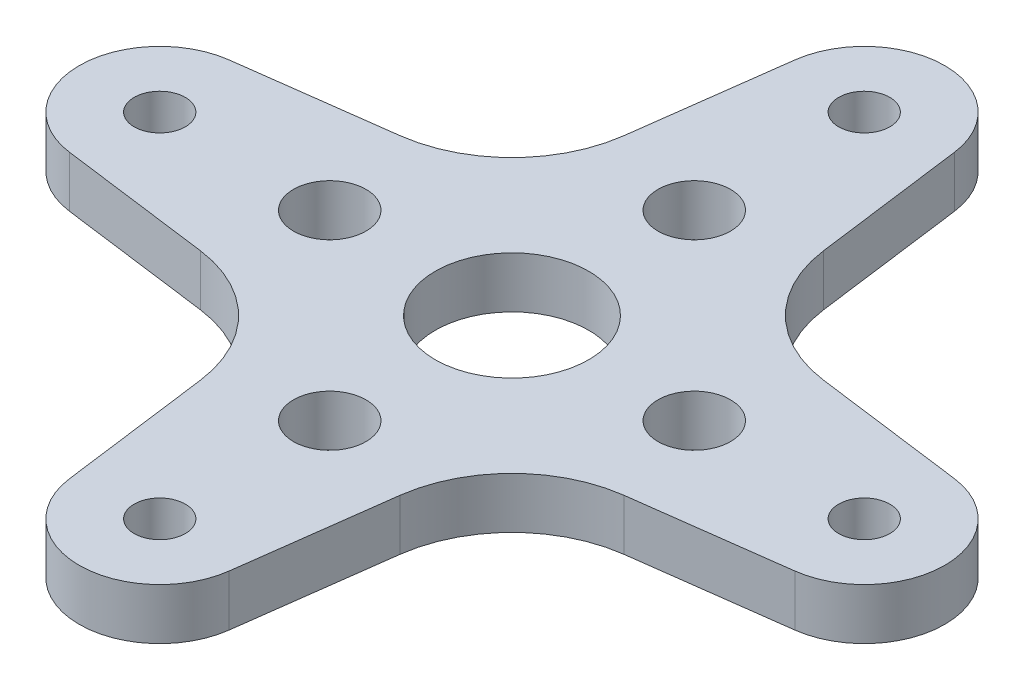
ISO-10303-21;
HEADER;
FILE_DESCRIPTION(('STEP AP214'),'2;1');
FILE_NAME('part.step','',(''),(''),'','','');
FILE_SCHEMA(('AUTOMOTIVE_DESIGN { 1 0 10303 214 1 1 1 1 }'));
ENDSEC;
DATA;
#1=APPLICATION_CONTEXT('core data for automotive mechanical design processes');
#2=APPLICATION_PROTOCOL_DEFINITION('international standard','automotive_design',2000,#1);
#3=PRODUCT_CONTEXT('',#1,'mechanical');
#4=PRODUCT('Part','Part','',(#3));
#5=PRODUCT_RELATED_PRODUCT_CATEGORY('part','',(#4));
#6=PRODUCT_DEFINITION_FORMATION('','',#4);
#7=PRODUCT_DEFINITION_CONTEXT('part definition',#1,'design');
#8=PRODUCT_DEFINITION('design','',#6,#7);
#9=PRODUCT_DEFINITION_SHAPE('','',#8);
#10=(LENGTH_UNIT() NAMED_UNIT(*) SI_UNIT(.MILLI.,.METRE.));
#11=(NAMED_UNIT(*) PLANE_ANGLE_UNIT() SI_UNIT($,.RADIAN.));
#12=(NAMED_UNIT(*) SI_UNIT($,.STERADIAN.) SOLID_ANGLE_UNIT());
#13=UNCERTAINTY_MEASURE_WITH_UNIT(LENGTH_MEASURE(1.E-05),#10,'distance_accuracy_value','');
#14=(GEOMETRIC_REPRESENTATION_CONTEXT(3) GLOBAL_UNCERTAINTY_ASSIGNED_CONTEXT((#13)) GLOBAL_UNIT_ASSIGNED_CONTEXT((#10,
#11,#12)) REPRESENTATION_CONTEXT('',''));
#15=CARTESIAN_POINT('',(0.,0.,0.));
#16=DIRECTION('',(0.,0.,1.));
#17=DIRECTION('',(1.,0.,0.));
#18=AXIS2_PLACEMENT_3D('',#15,#16,#17);
#19=CARTESIAN_POINT('',(0.,0.,-21.8652));
#20=DIRECTION('',(0.,-1.,0.));
#21=DIRECTION('',(0.,0.,-1.));
#22=AXIS2_PLACEMENT_3D('',#19,#20,#21);
#23=PLANE('',#22);
#24=CARTESIAN_POINT('',(0.,0.,-11.3137084989848));
#25=DIRECTION('',(0.,1.,0.));
#26=DIRECTION('',(0.,0.,1.));
#27=AXIS2_PLACEMENT_3D('',#24,#25,#26);
#28=CIRCLE('',#27,2.25);
#29=CARTESIAN_POINT('',(0.,0.,-9.06370849898476));
#30=VERTEX_POINT('',#29);
#31=EDGE_CURVE('E512',#30,#30,#28,.T.);
#32=ORIENTED_EDGE('',*,*,#31,.T.);
#33=EDGE_LOOP('',(#32));
#34=FACE_BOUND('',#33,.T.);
#35=CARTESIAN_POINT('',(11.3137084989848,0.,0.));
#36=DIRECTION('',(0.,1.,0.));
#37=DIRECTION('',(0.,0.,1.));
#38=AXIS2_PLACEMENT_3D('',#35,#36,#37);
#39=CIRCLE('',#38,2.25);
#40=CARTESIAN_POINT('',(11.3137084989848,0.,2.25));
#41=VERTEX_POINT('',#40);
#42=EDGE_CURVE('E506',#41,#41,#39,.T.);
#43=ORIENTED_EDGE('',*,*,#42,.T.);
#44=EDGE_LOOP('',(#43));
#45=FACE_BOUND('',#44,.T.);
#46=CARTESIAN_POINT('',(0.,0.,11.3137084989848));
#47=DIRECTION('',(0.,1.,0.));
#48=DIRECTION('',(0.,0.,1.));
#49=AXIS2_PLACEMENT_3D('',#46,#47,#48);
#50=CIRCLE('',#49,2.25);
#51=CARTESIAN_POINT('',(0.,0.,13.5637084989848));
#52=VERTEX_POINT('',#51);
#53=EDGE_CURVE('E500',#52,#52,#50,.T.);
#54=ORIENTED_EDGE('',*,*,#53,.T.);
#55=EDGE_LOOP('',(#54));
#56=FACE_BOUND('',#55,.T.);
#57=CARTESIAN_POINT('',(-11.3137084989848,0.,0.));
#58=DIRECTION('',(0.,1.,0.));
#59=DIRECTION('',(0.,0.,1.));
#60=AXIS2_PLACEMENT_3D('',#57,#58,#59);
#61=CIRCLE('',#60,2.25);
#62=CARTESIAN_POINT('',(-11.3137084989848,0.,2.25));
#63=VERTEX_POINT('',#62);
#64=EDGE_CURVE('E491',#63,#63,#61,.T.);
#65=ORIENTED_EDGE('',*,*,#64,.T.);
#66=EDGE_LOOP('',(#65));
#67=FACE_BOUND('',#66,.T.);
#68=CARTESIAN_POINT('',(0.,0.,0.));
#69=DIRECTION('',(0.,1.,0.));
#70=DIRECTION('',(0.,0.,1.));
#71=AXIS2_PLACEMENT_3D('',#68,#69,#70);
#72=CIRCLE('',#71,4.7625);
#73=CARTESIAN_POINT('',(0.,0.,4.7625));
#74=VERTEX_POINT('',#73);
#75=EDGE_CURVE('E488',#74,#74,#72,.T.);
#76=ORIENTED_EDGE('',*,*,#75,.T.);
#77=EDGE_LOOP('',(#76));
#78=FACE_BOUND('',#77,.T.);
#79=CARTESIAN_POINT('',(0.,0.,-21.8652));
#80=DIRECTION('',(0.,1.,0.));
#81=DIRECTION('',(0.,0.,1.));
#82=AXIS2_PLACEMENT_3D('',#79,#80,#81);
#83=CIRCLE('',#82,1.5875);
#84=CARTESIAN_POINT('',(0.,0.,-20.2777));
#85=VERTEX_POINT('',#84);
#86=EDGE_CURVE('E482',#85,#85,#83,.T.);
#87=ORIENTED_EDGE('',*,*,#86,.T.);
#88=EDGE_LOOP('',(#87));
#89=FACE_BOUND('',#88,.T.);
#90=CARTESIAN_POINT('',(0.,0.,-21.8652));
#91=DIRECTION('',(0.,1.,0.));
#92=DIRECTION('',(0.,0.,-1.));
#93=AXIS2_PLACEMENT_3D('',#90,#91,#92);
#94=CIRCLE('',#93,5.);
#95=CARTESIAN_POINT('',(4.95722430686906,0.,-22.5178309611002));
#96=VERTEX_POINT('',#95);
#97=CARTESIAN_POINT('',(-4.95722430686906,0.,-22.5178309611002));
#98=VERTEX_POINT('',#97);
#99=EDGE_CURVE('E145',#96,#98,#94,.T.);
#100=ORIENTED_EDGE('',*,*,#99,.F.);
#101=DIRECTION('',(-0.130526192220045,0.,-0.991444861373811));
#102=VECTOR('',#101,1.);
#103=CARTESIAN_POINT('',(4.95722430686906,0.,-22.5178309611002));
#104=LINE('',#103,#102);
#105=CARTESIAN_POINT('',(6.19257156323282,0.,-13.1344369579309));
#106=VERTEX_POINT('',#105);
#107=EDGE_CURVE('E93',#106,#96,#104,.T.);
#108=ORIENTED_EDGE('',*,*,#107,.F.);
#109=CARTESIAN_POINT('',(14.1869118191913,0.,-14.1869118191913));
#110=DIRECTION('',(0.,-1.,0.));
#111=DIRECTION('',(0.,0.,1.));
#112=AXIS2_PLACEMENT_3D('',#109,#110,#111);
#113=CIRCLE('',#112,8.06332310289146);
#114=CARTESIAN_POINT('',(13.1344369579309,0.,-6.19257156323278));
#115=VERTEX_POINT('',#114);
#116=EDGE_CURVE('E87',#115,#106,#113,.T.);
#117=ORIENTED_EDGE('',*,*,#116,.F.);
#118=DIRECTION('',(-0.991444861373811,0.,-0.130526192220049));
#119=VECTOR('',#118,1.);
#120=CARTESIAN_POINT('',(22.5178309611002,0.,-4.95722430686898));
#121=LINE('',#120,#119);
#122=CARTESIAN_POINT('',(22.5178309611002,0.,-4.95722430686898));
#123=VERTEX_POINT('',#122);
#124=EDGE_CURVE('E132',#123,#115,#121,.T.);
#125=ORIENTED_EDGE('',*,*,#124,.F.);
#126=CARTESIAN_POINT('',(21.8652,0.,0.));
#127=DIRECTION('',(0.,1.,0.));
#128=DIRECTION('',(0.,0.,1.));
#129=AXIS2_PLACEMENT_3D('',#126,#127,#128);
#130=CIRCLE('',#129,5.);
#131=CARTESIAN_POINT('',(22.5178309611002,0.,4.95722430686913));
#132=VERTEX_POINT('',#131);
#133=EDGE_CURVE('E163',#132,#123,#130,.T.);
#134=ORIENTED_EDGE('',*,*,#133,.F.);
#135=DIRECTION('',(0.991444861373812,0.,-0.130526192220042));
#136=VECTOR('',#135,1.);
#137=CARTESIAN_POINT('',(22.5178309611002,0.,4.95722430686913));
#138=LINE('',#137,#136);
#139=CARTESIAN_POINT('',(13.1344369579309,0.,6.19257156323287));
#140=VERTEX_POINT('',#139);
#141=EDGE_CURVE('E160',#140,#132,#138,.T.);
#142=ORIENTED_EDGE('',*,*,#141,.F.);
#143=CARTESIAN_POINT('',(14.1869118191912,0.,14.1869118191913));
#144=DIRECTION('',(0.,-1.,0.));
#145=DIRECTION('',(0.,0.,1.));
#146=AXIS2_PLACEMENT_3D('',#143,#144,#145);
#147=CIRCLE('',#146,8.06332310289146);
#148=CARTESIAN_POINT('',(6.19257156323283,0.,13.1344369579309));
#149=VERTEX_POINT('',#148);
#150=EDGE_CURVE('E157',#149,#140,#147,.T.);
#151=ORIENTED_EDGE('',*,*,#150,.F.);
#152=DIRECTION('',(-0.130526192220045,0.,0.991444861373811));
#153=VECTOR('',#152,1.);
#154=CARTESIAN_POINT('',(4.95722430686907,0.,22.5178309611002));
#155=LINE('',#154,#153);
#156=CARTESIAN_POINT('',(4.95722430686906,0.,22.5178309611002));
#157=VERTEX_POINT('',#156);
#158=EDGE_CURVE('E212',#149,#157,#155,.T.);
#159=ORIENTED_EDGE('',*,*,#158,.T.);
#160=CARTESIAN_POINT('',(0.,0.,21.8652));
#161=DIRECTION('',(0.,-1.,0.));
#162=DIRECTION('',(1.,0.,0.));
#163=AXIS2_PLACEMENT_3D('',#160,#161,#162);
#164=CIRCLE('',#163,5.);
#165=CARTESIAN_POINT('',(-4.95722430686904,0.,22.5178309611002));
#166=VERTEX_POINT('',#165);
#167=EDGE_CURVE('E220',#157,#166,#164,.T.);
#168=ORIENTED_EDGE('',*,*,#167,.T.);
#169=DIRECTION('',(-0.130526192220046,0.,-0.991444861373811));
#170=VECTOR('',#169,1.);
#171=CARTESIAN_POINT('',(-4.95722430686904,0.,22.5178309611002));
#172=LINE('',#171,#170);
#173=CARTESIAN_POINT('',(-6.19257156323282,0.,13.1344369579309));
#174=VERTEX_POINT('',#173);
#175=EDGE_CURVE('E305',#166,#174,#172,.T.);
#176=ORIENTED_EDGE('',*,*,#175,.T.);
#177=CARTESIAN_POINT('',(-14.1869118191913,0.,14.1869118191913));
#178=DIRECTION('',(0.,1.,0.));
#179=DIRECTION('',(1.,0.,0.));
#180=AXIS2_PLACEMENT_3D('',#177,#178,#179);
#181=CIRCLE('',#180,8.06332310289146);
#182=CARTESIAN_POINT('',(-13.1344369579309,0.,6.19257156323279));
#183=VERTEX_POINT('',#182);
#184=EDGE_CURVE('E301',#174,#183,#181,.T.);
#185=ORIENTED_EDGE('',*,*,#184,.T.);
#186=DIRECTION('',(-0.991444861373811,0.,-0.130526192220048));
#187=VECTOR('',#186,1.);
#188=CARTESIAN_POINT('',(-22.5178309611002,0.,4.957224306869));
#189=LINE('',#188,#187);
#190=CARTESIAN_POINT('',(-22.5178309611002,0.,4.957224306869));
#191=VERTEX_POINT('',#190);
#192=EDGE_CURVE('E297',#183,#191,#189,.T.);
#193=ORIENTED_EDGE('',*,*,#192,.T.);
#194=CARTESIAN_POINT('',(-21.8652,0.,0.));
#195=DIRECTION('',(0.,-1.,0.));
#196=DIRECTION('',(-1.,0.,0.));
#197=AXIS2_PLACEMENT_3D('',#194,#195,#196);
#198=CIRCLE('',#197,5.);
#199=CARTESIAN_POINT('',(-22.5178309611002,0.,-4.95722430686912));
#200=VERTEX_POINT('',#199);
#201=EDGE_CURVE('E206',#191,#200,#198,.T.);
#202=ORIENTED_EDGE('',*,*,#201,.T.);
#203=DIRECTION('',(0.991444861373812,0.,-0.130526192220042));
#204=VECTOR('',#203,1.);
#205=CARTESIAN_POINT('',(-22.5178309611002,0.,-4.95722430686912));
#206=LINE('',#205,#204);
#207=CARTESIAN_POINT('',(-13.1344369579309,0.,-6.19257156323286));
#208=VERTEX_POINT('',#207);
#209=EDGE_CURVE('E203',#200,#208,#206,.T.);
#210=ORIENTED_EDGE('',*,*,#209,.T.);
#211=CARTESIAN_POINT('',(-14.1869118191913,0.,-14.1869118191913));
#212=DIRECTION('',(0.,-1.,0.));
#213=DIRECTION('',(0.,0.,-1.));
#214=AXIS2_PLACEMENT_3D('',#211,#212,#213);
#215=CIRCLE('',#214,8.06332310289146);
#216=CARTESIAN_POINT('',(-6.19257156323282,0.,-13.1344369579309));
#217=VERTEX_POINT('',#216);
#218=EDGE_CURVE('E153',#217,#208,#215,.T.);
#219=ORIENTED_EDGE('',*,*,#218,.F.);
#220=DIRECTION('',(-0.130526192220045,0.,0.991444861373811));
#221=VECTOR('',#220,1.);
#222=CARTESIAN_POINT('',(-4.95722430686906,0.,-22.5178309611002));
#223=LINE('',#222,#221);
#224=EDGE_CURVE('E149',#98,#217,#223,.T.);
#225=ORIENTED_EDGE('',*,*,#224,.F.);
#226=EDGE_LOOP('',(#100,#108,#117,#125,#134,#142,#151,#159,#168,#176,#185,#193,#202,#210,#219,#225));
#227=FACE_BOUND('',#226,.T.);
#228=CARTESIAN_POINT('',(21.8652,0.,0.));
#229=DIRECTION('',(0.,1.,0.));
#230=DIRECTION('',(0.,0.,1.));
#231=AXIS2_PLACEMENT_3D('',#228,#229,#230);
#232=CIRCLE('',#231,1.5875);
#233=CARTESIAN_POINT('',(21.8652,0.,1.58750000000007));
#234=VERTEX_POINT('',#233);
#235=EDGE_CURVE('E298',#234,#234,#232,.T.);
#236=ORIENTED_EDGE('',*,*,#235,.T.);
#237=EDGE_LOOP('',(#236));
#238=FACE_BOUND('',#237,.T.);
#239=CARTESIAN_POINT('',(-21.8652,0.,0.));
#240=DIRECTION('',(0.,1.,0.));
#241=DIRECTION('',(0.,0.,1.));
#242=AXIS2_PLACEMENT_3D('',#239,#240,#241);
#243=CIRCLE('',#242,1.5875);
#244=CARTESIAN_POINT('',(-21.8652,0.,1.58749999999994));
#245=VERTEX_POINT('',#244);
#246=EDGE_CURVE('E466',#245,#245,#243,.T.);
#247=ORIENTED_EDGE('',*,*,#246,.T.);
#248=EDGE_LOOP('',(#247));
#249=FACE_BOUND('',#248,.T.);
#250=CARTESIAN_POINT('',(0.,0.,21.8652));
#251=DIRECTION('',(0.,1.,0.));
#252=DIRECTION('',(0.,0.,1.));
#253=AXIS2_PLACEMENT_3D('',#250,#251,#252);
#254=CIRCLE('',#253,1.5875);
#255=CARTESIAN_POINT('',(0.,0.,23.4527));
#256=VERTEX_POINT('',#255);
#257=EDGE_CURVE('E476',#256,#256,#254,.T.);
#258=ORIENTED_EDGE('',*,*,#257,.T.);
#259=EDGE_LOOP('',(#258));
#260=FACE_BOUND('',#259,.T.);
#261=ADVANCED_FACE('F39',(#34,#45,#56,#67,#78,#89,#227,#238,#249,#260),#23,.T.);
#262=CARTESIAN_POINT('',(0.,3.175,-21.8652));
#263=DIRECTION('',(0.,-1.,0.));
#264=DIRECTION('',(0.,0.,-1.));
#265=AXIS2_PLACEMENT_3D('',#262,#263,#264);
#266=CYLINDRICAL_SURFACE('',#265,5.);
#267=ORIENTED_EDGE('',*,*,#99,.T.);
#268=DIRECTION('',(0.,-1.,0.));
#269=VECTOR('',#268,1.);
#270=CARTESIAN_POINT('',(-4.95722430686906,3.175,-22.5178309611002));
#271=LINE('',#270,#269);
#272=CARTESIAN_POINT('',(-4.95722430686906,3.175,-22.5178309611002));
#273=VERTEX_POINT('',#272);
#274=EDGE_CURVE('E11',#273,#98,#271,.T.);
#275=ORIENTED_EDGE('',*,*,#274,.F.);
#276=CARTESIAN_POINT('',(0.,3.175,-21.8652));
#277=DIRECTION('',(0.,1.,0.));
#278=DIRECTION('',(0.,0.,-1.));
#279=AXIS2_PLACEMENT_3D('',#276,#277,#278);
#280=CIRCLE('',#279,5.);
#281=CARTESIAN_POINT('',(4.95722430686906,3.175,-22.5178309611002));
#282=VERTEX_POINT('',#281);
#283=EDGE_CURVE('E172',#282,#273,#280,.T.);
#284=ORIENTED_EDGE('',*,*,#283,.F.);
#285=DIRECTION('',(0.,-1.,0.));
#286=VECTOR('',#285,1.);
#287=CARTESIAN_POINT('',(4.95722430686906,3.175,-22.5178309611002));
#288=LINE('',#287,#286);
#289=EDGE_CURVE('E141',#282,#96,#288,.T.);
#290=ORIENTED_EDGE('',*,*,#289,.T.);
#291=EDGE_LOOP('',(#267,#275,#284,#290));
#292=FACE_BOUND('',#291,.T.);
#293=ADVANCED_FACE('F41',(#292),#266,.T.);
#294=CARTESIAN_POINT('',(-4.95722430686906,3.175,-22.5178309611002));
#295=DIRECTION('',(0.991444861373811,0.,0.130526192220045));
#296=DIRECTION('',(0.130526192220045,0.,-0.991444861373811));
#297=AXIS2_PLACEMENT_3D('',#294,#295,#296);
#298=PLANE('',#297);
#299=ORIENTED_EDGE('',*,*,#224,.T.);
#300=DIRECTION('',(0.,-1.,0.));
#301=VECTOR('',#300,1.);
#302=CARTESIAN_POINT('',(-6.19257156323282,3.175,-13.1344369579309));
#303=LINE('',#302,#301);
#304=CARTESIAN_POINT('',(-6.19257156323282,3.175,-13.1344369579309));
#305=VERTEX_POINT('',#304);
#306=EDGE_CURVE('E49',#305,#217,#303,.T.);
#307=ORIENTED_EDGE('',*,*,#306,.F.);
#308=DIRECTION('',(-0.130526192220045,0.,0.991444861373811));
#309=VECTOR('',#308,1.);
#310=CARTESIAN_POINT('',(-4.95722430686906,3.175,-22.5178309611002));
#311=LINE('',#310,#309);
#312=EDGE_CURVE('E101',#273,#305,#311,.T.);
#313=ORIENTED_EDGE('',*,*,#312,.F.);
#314=ORIENTED_EDGE('',*,*,#274,.T.);
#315=EDGE_LOOP('',(#299,#307,#313,#314));
#316=FACE_BOUND('',#315,.T.);
#317=ADVANCED_FACE('F356',(#316),#298,.F.);
#318=CARTESIAN_POINT('',(-14.1869118191913,3.175,-14.1869118191913));
#319=DIRECTION('',(0.,-1.,0.));
#320=DIRECTION('',(0.,0.,-1.));
#321=AXIS2_PLACEMENT_3D('',#318,#319,#320);
#322=CYLINDRICAL_SURFACE('',#321,8.06332310289146);
#323=ORIENTED_EDGE('',*,*,#218,.T.);
#324=DIRECTION('',(0.,-1.,0.));
#325=VECTOR('',#324,1.);
#326=CARTESIAN_POINT('',(-13.1344369579309,3.175,-6.19257156323286));
#327=LINE('',#326,#325);
#328=CARTESIAN_POINT('',(-13.1344369579309,3.175,-6.19257156323286));
#329=VERTEX_POINT('',#328);
#330=EDGE_CURVE('E228',#329,#208,#327,.T.);
#331=ORIENTED_EDGE('',*,*,#330,.F.);
#332=CARTESIAN_POINT('',(-14.1869118191913,3.175,-14.1869118191913));
#333=DIRECTION('',(0.,-1.,0.));
#334=DIRECTION('',(0.,0.,-1.));
#335=AXIS2_PLACEMENT_3D('',#332,#333,#334);
#336=CIRCLE('',#335,8.06332310289146);
#337=EDGE_CURVE('E196',#305,#329,#336,.T.);
#338=ORIENTED_EDGE('',*,*,#337,.F.);
#339=ORIENTED_EDGE('',*,*,#306,.T.);
#340=EDGE_LOOP('',(#323,#331,#338,#339));
#341=FACE_BOUND('',#340,.T.);
#342=ADVANCED_FACE('F191',(#341),#322,.F.);
#343=CARTESIAN_POINT('',(14.1869118191912,3.175,14.1869118191913));
#344=DIRECTION('',(0.,-1.,0.));
#345=DIRECTION('',(0.,0.,-1.));
#346=AXIS2_PLACEMENT_3D('',#343,#344,#345);
#347=CYLINDRICAL_SURFACE('',#346,8.06332310289146);
#348=ORIENTED_EDGE('',*,*,#150,.T.);
#349=DIRECTION('',(0.,-1.,0.));
#350=VECTOR('',#349,1.);
#351=CARTESIAN_POINT('',(13.1344369579309,3.175,6.19257156323287));
#352=LINE('',#351,#350);
#353=CARTESIAN_POINT('',(13.1344369579309,3.175,6.19257156323287));
#354=VERTEX_POINT('',#353);
#355=EDGE_CURVE('E183',#354,#140,#352,.T.);
#356=ORIENTED_EDGE('',*,*,#355,.F.);
#357=CARTESIAN_POINT('',(14.1869118191912,3.175,14.1869118191913));
#358=DIRECTION('',(0.,-1.,0.));
#359=DIRECTION('',(0.,0.,1.));
#360=AXIS2_PLACEMENT_3D('',#357,#358,#359);
#361=CIRCLE('',#360,8.06332310289146);
#362=CARTESIAN_POINT('',(6.19257156323283,3.175,13.1344369579309));
#363=VERTEX_POINT('',#362);
#364=EDGE_CURVE('E261',#363,#354,#361,.T.);
#365=ORIENTED_EDGE('',*,*,#364,.F.);
#366=DIRECTION('',(0.,-1.,0.));
#367=VECTOR('',#366,1.);
#368=CARTESIAN_POINT('',(6.19257156323283,3.175,13.1344369579309));
#369=LINE('',#368,#367);
#370=EDGE_CURVE('E232',#363,#149,#369,.T.);
#371=ORIENTED_EDGE('',*,*,#370,.T.);
#372=EDGE_LOOP('',(#348,#356,#365,#371));
#373=FACE_BOUND('',#372,.T.);
#374=ADVANCED_FACE('F362',(#373),#347,.F.);
#375=CARTESIAN_POINT('',(22.5178309611002,3.175,4.95722430686913));
#376=DIRECTION('',(-0.130526192220042,0.,-0.991444861373812));
#377=DIRECTION('',(-0.991444861373812,0.,0.130526192220042));
#378=AXIS2_PLACEMENT_3D('',#375,#376,#377);
#379=PLANE('',#378);
#380=ORIENTED_EDGE('',*,*,#141,.T.);
#381=DIRECTION('',(0.,-1.,0.));
#382=VECTOR('',#381,1.);
#383=CARTESIAN_POINT('',(22.5178309611002,3.175,4.95722430686913));
#384=LINE('',#383,#382);
#385=CARTESIAN_POINT('',(22.5178309611002,3.175,4.95722430686913));
#386=VERTEX_POINT('',#385);
#387=EDGE_CURVE('E179',#386,#132,#384,.T.);
#388=ORIENTED_EDGE('',*,*,#387,.F.);
#389=DIRECTION('',(0.991444861373812,0.,-0.130526192220042));
#390=VECTOR('',#389,1.);
#391=CARTESIAN_POINT('',(22.5178309611002,3.175,4.95722430686913));
#392=LINE('',#391,#390);
#393=EDGE_CURVE('E264',#354,#386,#392,.T.);
#394=ORIENTED_EDGE('',*,*,#393,.F.);
#395=ORIENTED_EDGE('',*,*,#355,.T.);
#396=EDGE_LOOP('',(#380,#388,#394,#395));
#397=FACE_BOUND('',#396,.T.);
#398=ADVANCED_FACE('F384',(#397),#379,.F.);
#399=CARTESIAN_POINT('',(21.8652,3.175,0.));
#400=DIRECTION('',(0.,-1.,0.));
#401=DIRECTION('',(0.,0.,-1.));
#402=AXIS2_PLACEMENT_3D('',#399,#400,#401);
#403=CYLINDRICAL_SURFACE('',#402,5.);
#404=ORIENTED_EDGE('',*,*,#133,.T.);
#405=DIRECTION('',(0.,-1.,0.));
#406=VECTOR('',#405,1.);
#407=CARTESIAN_POINT('',(22.5178309611002,3.175,-4.95722430686898));
#408=LINE('',#407,#406);
#409=CARTESIAN_POINT('',(22.5178309611002,3.175,-4.95722430686898));
#410=VERTEX_POINT('',#409);
#411=EDGE_CURVE('E134',#410,#123,#408,.T.);
#412=ORIENTED_EDGE('',*,*,#411,.F.);
#413=CARTESIAN_POINT('',(21.8652,3.175,0.));
#414=DIRECTION('',(0.,1.,0.));
#415=DIRECTION('',(0.,0.,1.));
#416=AXIS2_PLACEMENT_3D('',#413,#414,#415);
#417=CIRCLE('',#416,5.);
#418=EDGE_CURVE('E123',#386,#410,#417,.T.);
#419=ORIENTED_EDGE('',*,*,#418,.F.);
#420=ORIENTED_EDGE('',*,*,#387,.T.);
#421=EDGE_LOOP('',(#404,#412,#419,#420));
#422=FACE_BOUND('',#421,.T.);
#423=ADVANCED_FACE('F381',(#422),#403,.T.);
#424=CARTESIAN_POINT('',(22.5178309611002,3.175,-4.95722430686898));
#425=DIRECTION('',(-0.130526192220049,0.,0.991444861373811));
#426=DIRECTION('',(0.991444861373811,0.,0.130526192220049));
#427=AXIS2_PLACEMENT_3D('',#424,#425,#426);
#428=PLANE('',#427);
#429=ORIENTED_EDGE('',*,*,#124,.T.);
#430=DIRECTION('',(0.,-1.,0.));
#431=VECTOR('',#430,1.);
#432=CARTESIAN_POINT('',(13.1344369579309,3.175,-6.19257156323278));
#433=LINE('',#432,#431);
#434=CARTESIAN_POINT('',(13.1344369579309,3.175,-6.19257156323278));
#435=VERTEX_POINT('',#434);
#436=EDGE_CURVE('E129',#435,#115,#433,.T.);
#437=ORIENTED_EDGE('',*,*,#436,.F.);
#438=DIRECTION('',(-0.991444861373811,0.,-0.130526192220049));
#439=VECTOR('',#438,1.);
#440=CARTESIAN_POINT('',(22.5178309611002,3.175,-4.95722430686898));
#441=LINE('',#440,#439);
#442=EDGE_CURVE('E117',#410,#435,#441,.T.);
#443=ORIENTED_EDGE('',*,*,#442,.F.);
#444=ORIENTED_EDGE('',*,*,#411,.T.);
#445=EDGE_LOOP('',(#429,#437,#443,#444));
#446=FACE_BOUND('',#445,.T.);
#447=ADVANCED_FACE('F130',(#446),#428,.F.);
#448=CARTESIAN_POINT('',(14.1869118191913,3.175,-14.1869118191913));
#449=DIRECTION('',(0.,-1.,0.));
#450=DIRECTION('',(0.,0.,-1.));
#451=AXIS2_PLACEMENT_3D('',#448,#449,#450);
#452=CYLINDRICAL_SURFACE('',#451,8.06332310289146);
#453=ORIENTED_EDGE('',*,*,#116,.T.);
#454=DIRECTION('',(0.,-1.,0.));
#455=VECTOR('',#454,1.);
#456=CARTESIAN_POINT('',(6.19257156323282,3.175,-13.1344369579309));
#457=LINE('',#456,#455);
#458=CARTESIAN_POINT('',(6.19257156323282,3.175,-13.1344369579309));
#459=VERTEX_POINT('',#458);
#460=EDGE_CURVE('E135',#459,#106,#457,.T.);
#461=ORIENTED_EDGE('',*,*,#460,.F.);
#462=CARTESIAN_POINT('',(14.1869118191913,3.175,-14.1869118191913));
#463=DIRECTION('',(0.,-1.,0.));
#464=DIRECTION('',(0.,0.,1.));
#465=AXIS2_PLACEMENT_3D('',#462,#463,#464);
#466=CIRCLE('',#465,8.06332310289146);
#467=EDGE_CURVE('E121',#435,#459,#466,.T.);
#468=ORIENTED_EDGE('',*,*,#467,.F.);
#469=ORIENTED_EDGE('',*,*,#436,.T.);
#470=EDGE_LOOP('',(#453,#461,#468,#469));
#471=FACE_BOUND('',#470,.T.);
#472=ADVANCED_FACE('F137',(#471),#452,.F.);
#473=CARTESIAN_POINT('',(4.95722430686906,3.175,-22.5178309611002));
#474=DIRECTION('',(-0.991444861373811,0.,0.130526192220045));
#475=DIRECTION('',(0.130526192220045,0.,0.991444861373811));
#476=AXIS2_PLACEMENT_3D('',#473,#474,#475);
#477=PLANE('',#476);
#478=ORIENTED_EDGE('',*,*,#107,.T.);
#479=ORIENTED_EDGE('',*,*,#289,.F.);
#480=DIRECTION('',(-0.130526192220045,0.,-0.991444861373811));
#481=VECTOR('',#480,1.);
#482=CARTESIAN_POINT('',(4.95722430686906,3.175,-22.5178309611002));
#483=LINE('',#482,#481);
#484=EDGE_CURVE('E57',#459,#282,#483,.T.);
#485=ORIENTED_EDGE('',*,*,#484,.F.);
#486=ORIENTED_EDGE('',*,*,#460,.T.);
#487=EDGE_LOOP('',(#478,#479,#485,#486));
#488=FACE_BOUND('',#487,.T.);
#489=ADVANCED_FACE('F374',(#488),#477,.F.);
#490=CARTESIAN_POINT('',(0.,3.175,-21.8652));
#491=DIRECTION('',(0.,-1.,0.));
#492=DIRECTION('',(0.,0.,-1.));
#493=AXIS2_PLACEMENT_3D('',#490,#491,#492);
#494=PLANE('',#493);
#495=CARTESIAN_POINT('',(0.,3.175,-11.3137084989848));
#496=DIRECTION('',(0.,1.,0.));
#497=DIRECTION('',(0.,0.,1.));
#498=AXIS2_PLACEMENT_3D('',#495,#496,#497);
#499=CIRCLE('',#498,2.25);
#500=CARTESIAN_POINT('',(0.,3.175,-9.06370849898476));
#501=VERTEX_POINT('',#500);
#502=EDGE_CURVE('E432',#501,#501,#499,.T.);
#503=ORIENTED_EDGE('',*,*,#502,.F.);
#504=EDGE_LOOP('',(#503));
#505=FACE_BOUND('',#504,.T.);
#506=CARTESIAN_POINT('',(11.3137084989848,3.175,0.));
#507=DIRECTION('',(0.,1.,0.));
#508=DIRECTION('',(0.,0.,1.));
#509=AXIS2_PLACEMENT_3D('',#506,#507,#508);
#510=CIRCLE('',#509,2.25);
#511=CARTESIAN_POINT('',(11.3137084989848,3.175,2.25));
#512=VERTEX_POINT('',#511);
#513=EDGE_CURVE('E436',#512,#512,#510,.T.);
#514=ORIENTED_EDGE('',*,*,#513,.F.);
#515=EDGE_LOOP('',(#514));
#516=FACE_BOUND('',#515,.T.);
#517=CARTESIAN_POINT('',(0.,3.175,11.3137084989848));
#518=DIRECTION('',(0.,1.,0.));
#519=DIRECTION('',(0.,0.,1.));
#520=AXIS2_PLACEMENT_3D('',#517,#518,#519);
#521=CIRCLE('',#520,2.25);
#522=CARTESIAN_POINT('',(0.,3.175,13.5637084989848));
#523=VERTEX_POINT('',#522);
#524=EDGE_CURVE('E440',#523,#523,#521,.T.);
#525=ORIENTED_EDGE('',*,*,#524,.F.);
#526=EDGE_LOOP('',(#525));
#527=FACE_BOUND('',#526,.T.);
#528=CARTESIAN_POINT('',(-11.3137084989848,3.175,0.));
#529=DIRECTION('',(0.,1.,0.));
#530=DIRECTION('',(0.,0.,1.));
#531=AXIS2_PLACEMENT_3D('',#528,#529,#530);
#532=CIRCLE('',#531,2.25);
#533=CARTESIAN_POINT('',(-11.3137084989848,3.175,2.25));
#534=VERTEX_POINT('',#533);
#535=EDGE_CURVE('E444',#534,#534,#532,.T.);
#536=ORIENTED_EDGE('',*,*,#535,.F.);
#537=EDGE_LOOP('',(#536));
#538=FACE_BOUND('',#537,.T.);
#539=CARTESIAN_POINT('',(0.,3.175,0.));
#540=DIRECTION('',(0.,1.,0.));
#541=DIRECTION('',(0.,0.,1.));
#542=AXIS2_PLACEMENT_3D('',#539,#540,#541);
#543=CIRCLE('',#542,4.7625);
#544=CARTESIAN_POINT('',(0.,3.175,4.7625));
#545=VERTEX_POINT('',#544);
#546=EDGE_CURVE('E448',#545,#545,#543,.T.);
#547=ORIENTED_EDGE('',*,*,#546,.F.);
#548=EDGE_LOOP('',(#547));
#549=FACE_BOUND('',#548,.T.);
#550=CARTESIAN_POINT('',(0.,3.175,-21.8652));
#551=DIRECTION('',(0.,1.,0.));
#552=DIRECTION('',(0.,0.,1.));
#553=AXIS2_PLACEMENT_3D('',#550,#551,#552);
#554=CIRCLE('',#553,1.5875);
#555=CARTESIAN_POINT('',(0.,3.175,-20.2777));
#556=VERTEX_POINT('',#555);
#557=EDGE_CURVE('E452',#556,#556,#554,.T.);
#558=ORIENTED_EDGE('',*,*,#557,.F.);
#559=EDGE_LOOP('',(#558));
#560=FACE_BOUND('',#559,.T.);
#561=CARTESIAN_POINT('',(0.,3.175,21.8652));
#562=DIRECTION('',(0.,1.,0.));
#563=DIRECTION('',(0.,0.,1.));
#564=AXIS2_PLACEMENT_3D('',#561,#562,#563);
#565=CIRCLE('',#564,1.5875);
#566=CARTESIAN_POINT('',(0.,3.175,23.4527));
#567=VERTEX_POINT('',#566);
#568=EDGE_CURVE('E456',#567,#567,#565,.T.);
#569=ORIENTED_EDGE('',*,*,#568,.F.);
#570=EDGE_LOOP('',(#569));
#571=FACE_BOUND('',#570,.T.);
#572=CARTESIAN_POINT('',(-21.8652,3.175,0.));
#573=DIRECTION('',(0.,1.,0.));
#574=DIRECTION('',(0.,0.,1.));
#575=AXIS2_PLACEMENT_3D('',#572,#573,#574);
#576=CIRCLE('',#575,1.5875);
#577=CARTESIAN_POINT('',(-21.8652,3.175,1.58749999999994));
#578=VERTEX_POINT('',#577);
#579=EDGE_CURVE('E460',#578,#578,#576,.T.);
#580=ORIENTED_EDGE('',*,*,#579,.F.);
#581=EDGE_LOOP('',(#580));
#582=FACE_BOUND('',#581,.T.);
#583=CARTESIAN_POINT('',(21.8652,3.175,0.));
#584=DIRECTION('',(0.,1.,0.));
#585=DIRECTION('',(0.,0.,1.));
#586=AXIS2_PLACEMENT_3D('',#583,#584,#585);
#587=CIRCLE('',#586,1.5875);
#588=CARTESIAN_POINT('',(21.8652,3.175,1.58750000000007));
#589=VERTEX_POINT('',#588);
#590=EDGE_CURVE('E463',#589,#589,#587,.T.);
#591=ORIENTED_EDGE('',*,*,#590,.F.);
#592=EDGE_LOOP('',(#591));
#593=FACE_BOUND('',#592,.T.);
#594=ORIENTED_EDGE('',*,*,#283,.T.);
#595=ORIENTED_EDGE('',*,*,#312,.T.);
#596=ORIENTED_EDGE('',*,*,#337,.T.);
#597=DIRECTION('',(0.991444861373812,0.,-0.130526192220042));
#598=VECTOR('',#597,1.);
#599=CARTESIAN_POINT('',(-22.5178309611002,3.175,-4.95722430686912));
#600=LINE('',#599,#598);
#601=CARTESIAN_POINT('',(-22.5178309611002,3.175,-4.95722430686912));
#602=VERTEX_POINT('',#601);
#603=EDGE_CURVE('E229',#602,#329,#600,.T.);
#604=ORIENTED_EDGE('',*,*,#603,.F.);
#605=CARTESIAN_POINT('',(-21.8652,3.175,0.));
#606=DIRECTION('',(0.,-1.,0.));
#607=DIRECTION('',(-1.,0.,0.));
#608=AXIS2_PLACEMENT_3D('',#605,#606,#607);
#609=CIRCLE('',#608,5.);
#610=CARTESIAN_POINT('',(-22.5178309611002,3.175,4.957224306869));
#611=VERTEX_POINT('',#610);
#612=EDGE_CURVE('E211',#611,#602,#609,.T.);
#613=ORIENTED_EDGE('',*,*,#612,.F.);
#614=DIRECTION('',(-0.991444861373811,0.,-0.130526192220048));
#615=VECTOR('',#614,1.);
#616=CARTESIAN_POINT('',(-22.5178309611002,3.175,4.957224306869));
#617=LINE('',#616,#615);
#618=CARTESIAN_POINT('',(-13.1344369579309,3.175,6.19257156323279));
#619=VERTEX_POINT('',#618);
#620=EDGE_CURVE('E217',#619,#611,#617,.T.);
#621=ORIENTED_EDGE('',*,*,#620,.F.);
#622=CARTESIAN_POINT('',(-14.1869118191913,3.175,14.1869118191913));
#623=DIRECTION('',(0.,1.,0.));
#624=DIRECTION('',(1.,0.,0.));
#625=AXIS2_PLACEMENT_3D('',#622,#623,#624);
#626=CIRCLE('',#625,8.06332310289146);
#627=CARTESIAN_POINT('',(-6.19257156323282,3.175,13.1344369579309));
#628=VERTEX_POINT('',#627);
#629=EDGE_CURVE('E282',#628,#619,#626,.T.);
#630=ORIENTED_EDGE('',*,*,#629,.F.);
#631=DIRECTION('',(-0.130526192220046,0.,-0.991444861373811));
#632=VECTOR('',#631,1.);
#633=CARTESIAN_POINT('',(-4.95722430686904,3.175,22.5178309611002));
#634=LINE('',#633,#632);
#635=CARTESIAN_POINT('',(-4.95722430686904,3.175,22.5178309611002));
#636=VERTEX_POINT('',#635);
#637=EDGE_CURVE('E278',#636,#628,#634,.T.);
#638=ORIENTED_EDGE('',*,*,#637,.F.);
#639=CARTESIAN_POINT('',(0.,3.175,21.8652));
#640=DIRECTION('',(0.,-1.,0.));
#641=DIRECTION('',(1.,0.,0.));
#642=AXIS2_PLACEMENT_3D('',#639,#640,#641);
#643=CIRCLE('',#642,5.);
#644=CARTESIAN_POINT('',(4.95722430686906,3.175,22.5178309611002));
#645=VERTEX_POINT('',#644);
#646=EDGE_CURVE('E274',#645,#636,#643,.T.);
#647=ORIENTED_EDGE('',*,*,#646,.F.);
#648=DIRECTION('',(-0.130526192220045,0.,0.991444861373811));
#649=VECTOR('',#648,1.);
#650=CARTESIAN_POINT('',(4.95722430686907,3.175,22.5178309611002));
#651=LINE('',#650,#649);
#652=EDGE_CURVE('E270',#363,#645,#651,.T.);
#653=ORIENTED_EDGE('',*,*,#652,.F.);
#654=ORIENTED_EDGE('',*,*,#364,.T.);
#655=ORIENTED_EDGE('',*,*,#393,.T.);
#656=ORIENTED_EDGE('',*,*,#418,.T.);
#657=ORIENTED_EDGE('',*,*,#442,.T.);
#658=ORIENTED_EDGE('',*,*,#467,.T.);
#659=ORIENTED_EDGE('',*,*,#484,.T.);
#660=EDGE_LOOP('',(#594,#595,#596,#604,#613,#621,#630,#638,#647,#653,#654,#655,#656,#657,#658,#659));
#661=FACE_BOUND('',#660,.T.);
#662=ADVANCED_FACE('F119',(#505,#516,#527,#538,#549,#560,#571,#582,#593,#661),#494,.F.);
#663=CARTESIAN_POINT('',(-21.8652,3.175,0.));
#664=DIRECTION('',(0.,-1.,0.));
#665=DIRECTION('',(0.,0.,-1.));
#666=AXIS2_PLACEMENT_3D('',#663,#664,#665);
#667=CYLINDRICAL_SURFACE('',#666,5.);
#668=ORIENTED_EDGE('',*,*,#201,.F.);
#669=DIRECTION('',(0.,-1.,0.));
#670=VECTOR('',#669,1.);
#671=CARTESIAN_POINT('',(-22.5178309611002,3.175,4.957224306869));
#672=LINE('',#671,#670);
#673=EDGE_CURVE('E150',#611,#191,#672,.T.);
#674=ORIENTED_EDGE('',*,*,#673,.F.);
#675=ORIENTED_EDGE('',*,*,#612,.T.);
#676=DIRECTION('',(0.,-1.,0.));
#677=VECTOR('',#676,1.);
#678=CARTESIAN_POINT('',(-22.5178309611002,3.175,-4.95722430686912));
#679=LINE('',#678,#677);
#680=EDGE_CURVE('E224',#602,#200,#679,.T.);
#681=ORIENTED_EDGE('',*,*,#680,.T.);
#682=EDGE_LOOP('',(#668,#674,#675,#681));
#683=FACE_BOUND('',#682,.T.);
#684=ADVANCED_FACE('F350',(#683),#667,.T.);
#685=CARTESIAN_POINT('',(-22.5178309611002,3.175,4.957224306869));
#686=DIRECTION('',(-0.130526192220048,0.,0.991444861373811));
#687=DIRECTION('',(0.991444861373811,0.,0.130526192220048));
#688=AXIS2_PLACEMENT_3D('',#685,#686,#687);
#689=PLANE('',#688);
#690=ORIENTED_EDGE('',*,*,#192,.F.);
#691=DIRECTION('',(0.,-1.,0.));
#692=VECTOR('',#691,1.);
#693=CARTESIAN_POINT('',(-13.1344369579309,3.175,6.19257156323279));
#694=LINE('',#693,#692);
#695=EDGE_CURVE('E248',#619,#183,#694,.T.);
#696=ORIENTED_EDGE('',*,*,#695,.F.);
#697=ORIENTED_EDGE('',*,*,#620,.T.);
#698=ORIENTED_EDGE('',*,*,#673,.T.);
#699=EDGE_LOOP('',(#690,#696,#697,#698));
#700=FACE_BOUND('',#699,.T.);
#701=ADVANCED_FACE('F419',(#700),#689,.T.);
#702=CARTESIAN_POINT('',(-14.1869118191913,3.175,14.1869118191913));
#703=DIRECTION('',(0.,-1.,0.));
#704=DIRECTION('',(0.,0.,-1.));
#705=AXIS2_PLACEMENT_3D('',#702,#703,#704);
#706=CYLINDRICAL_SURFACE('',#705,8.06332310289146);
#707=ORIENTED_EDGE('',*,*,#184,.F.);
#708=DIRECTION('',(0.,-1.,0.));
#709=VECTOR('',#708,1.);
#710=CARTESIAN_POINT('',(-6.19257156323282,3.175,13.1344369579309));
#711=LINE('',#710,#709);
#712=EDGE_CURVE('E244',#628,#174,#711,.T.);
#713=ORIENTED_EDGE('',*,*,#712,.F.);
#714=ORIENTED_EDGE('',*,*,#629,.T.);
#715=ORIENTED_EDGE('',*,*,#695,.T.);
#716=EDGE_LOOP('',(#707,#713,#714,#715));
#717=FACE_BOUND('',#716,.T.);
#718=ADVANCED_FACE('F415',(#717),#706,.F.);
#719=CARTESIAN_POINT('',(-4.95722430686904,3.175,22.5178309611002));
#720=DIRECTION('',(-0.991444861373811,0.,0.130526192220046));
#721=DIRECTION('',(0.130526192220046,0.,0.991444861373811));
#722=AXIS2_PLACEMENT_3D('',#719,#720,#721);
#723=PLANE('',#722);
#724=ORIENTED_EDGE('',*,*,#175,.F.);
#725=DIRECTION('',(0.,-1.,0.));
#726=VECTOR('',#725,1.);
#727=CARTESIAN_POINT('',(-4.95722430686904,3.175,22.5178309611002));
#728=LINE('',#727,#726);
#729=EDGE_CURVE('E240',#636,#166,#728,.T.);
#730=ORIENTED_EDGE('',*,*,#729,.F.);
#731=ORIENTED_EDGE('',*,*,#637,.T.);
#732=ORIENTED_EDGE('',*,*,#712,.T.);
#733=EDGE_LOOP('',(#724,#730,#731,#732));
#734=FACE_BOUND('',#733,.T.);
#735=ADVANCED_FACE('F409',(#734),#723,.T.);
#736=CARTESIAN_POINT('',(0.,3.175,21.8652));
#737=DIRECTION('',(0.,-1.,0.));
#738=DIRECTION('',(0.,0.,-1.));
#739=AXIS2_PLACEMENT_3D('',#736,#737,#738);
#740=CYLINDRICAL_SURFACE('',#739,5.);
#741=ORIENTED_EDGE('',*,*,#167,.F.);
#742=DIRECTION('',(0.,-1.,0.));
#743=VECTOR('',#742,1.);
#744=CARTESIAN_POINT('',(4.95722430686906,3.175,22.5178309611002));
#745=LINE('',#744,#743);
#746=EDGE_CURVE('E236',#645,#157,#745,.T.);
#747=ORIENTED_EDGE('',*,*,#746,.F.);
#748=ORIENTED_EDGE('',*,*,#646,.T.);
#749=ORIENTED_EDGE('',*,*,#729,.T.);
#750=EDGE_LOOP('',(#741,#747,#748,#749));
#751=FACE_BOUND('',#750,.T.);
#752=ADVANCED_FACE('F320',(#751),#740,.T.);
#753=CARTESIAN_POINT('',(4.95722430686907,3.175,22.5178309611002));
#754=DIRECTION('',(0.991444861373811,0.,0.130526192220045));
#755=DIRECTION('',(0.130526192220045,0.,-0.991444861373811));
#756=AXIS2_PLACEMENT_3D('',#753,#754,#755);
#757=PLANE('',#756);
#758=ORIENTED_EDGE('',*,*,#158,.F.);
#759=ORIENTED_EDGE('',*,*,#370,.F.);
#760=ORIENTED_EDGE('',*,*,#652,.T.);
#761=ORIENTED_EDGE('',*,*,#746,.T.);
#762=EDGE_LOOP('',(#758,#759,#760,#761));
#763=FACE_BOUND('',#762,.T.);
#764=ADVANCED_FACE('F400',(#763),#757,.T.);
#765=CARTESIAN_POINT('',(-22.5178309611002,3.175,-4.95722430686912));
#766=DIRECTION('',(-0.130526192220042,0.,-0.991444861373812));
#767=DIRECTION('',(-0.991444861373812,0.,0.130526192220042));
#768=AXIS2_PLACEMENT_3D('',#765,#766,#767);
#769=PLANE('',#768);
#770=ORIENTED_EDGE('',*,*,#209,.F.);
#771=ORIENTED_EDGE('',*,*,#680,.F.);
#772=ORIENTED_EDGE('',*,*,#603,.T.);
#773=ORIENTED_EDGE('',*,*,#330,.T.);
#774=EDGE_LOOP('',(#770,#771,#772,#773));
#775=FACE_BOUND('',#774,.T.);
#776=ADVANCED_FACE('F352',(#775),#769,.T.);
#777=CARTESIAN_POINT('',(21.8652,3.175,0.));
#778=DIRECTION('',(0.,1.,0.));
#779=DIRECTION('',(0.,0.,1.));
#780=AXIS2_PLACEMENT_3D('',#777,#778,#779);
#781=CYLINDRICAL_SURFACE('',#780,1.5875);
#782=ORIENTED_EDGE('',*,*,#235,.F.);
#783=EDGE_LOOP('',(#782));
#784=FACE_BOUND('',#783,.T.);
#785=ORIENTED_EDGE('',*,*,#590,.T.);
#786=EDGE_LOOP('',(#785));
#787=FACE_BOUND('',#786,.T.);
#788=ADVANCED_FACE('F407',(#784,#787),#781,.F.);
#789=CARTESIAN_POINT('',(-21.8652,3.175,0.));
#790=DIRECTION('',(0.,1.,0.));
#791=DIRECTION('',(0.,0.,1.));
#792=AXIS2_PLACEMENT_3D('',#789,#790,#791);
#793=CYLINDRICAL_SURFACE('',#792,1.5875);
#794=ORIENTED_EDGE('',*,*,#246,.F.);
#795=EDGE_LOOP('',(#794));
#796=FACE_BOUND('',#795,.T.);
#797=ORIENTED_EDGE('',*,*,#579,.T.);
#798=EDGE_LOOP('',(#797));
#799=FACE_BOUND('',#798,.T.);
#800=ADVANCED_FACE('F548',(#796,#799),#793,.F.);
#801=CARTESIAN_POINT('',(0.,3.175,21.8652));
#802=DIRECTION('',(0.,1.,0.));
#803=DIRECTION('',(0.,0.,1.));
#804=AXIS2_PLACEMENT_3D('',#801,#802,#803);
#805=CYLINDRICAL_SURFACE('',#804,1.5875);
#806=ORIENTED_EDGE('',*,*,#257,.F.);
#807=EDGE_LOOP('',(#806));
#808=FACE_BOUND('',#807,.T.);
#809=ORIENTED_EDGE('',*,*,#568,.T.);
#810=EDGE_LOOP('',(#809));
#811=FACE_BOUND('',#810,.T.);
#812=ADVANCED_FACE('F544',(#808,#811),#805,.F.);
#813=CARTESIAN_POINT('',(0.,3.175,-21.8652));
#814=DIRECTION('',(0.,1.,0.));
#815=DIRECTION('',(0.,0.,1.));
#816=AXIS2_PLACEMENT_3D('',#813,#814,#815);
#817=CYLINDRICAL_SURFACE('',#816,1.5875);
#818=ORIENTED_EDGE('',*,*,#86,.F.);
#819=EDGE_LOOP('',(#818));
#820=FACE_BOUND('',#819,.T.);
#821=ORIENTED_EDGE('',*,*,#557,.T.);
#822=EDGE_LOOP('',(#821));
#823=FACE_BOUND('',#822,.T.);
#824=ADVANCED_FACE('F540',(#820,#823),#817,.F.);
#825=CARTESIAN_POINT('',(0.,0.,0.));
#826=DIRECTION('',(0.,1.,0.));
#827=DIRECTION('',(0.,0.,1.));
#828=AXIS2_PLACEMENT_3D('',#825,#826,#827);
#829=CYLINDRICAL_SURFACE('',#828,4.7625);
#830=ORIENTED_EDGE('',*,*,#75,.F.);
#831=EDGE_LOOP('',(#830));
#832=FACE_BOUND('',#831,.T.);
#833=ORIENTED_EDGE('',*,*,#546,.T.);
#834=EDGE_LOOP('',(#833));
#835=FACE_BOUND('',#834,.T.);
#836=ADVANCED_FACE('F536',(#832,#835),#829,.F.);
#837=CARTESIAN_POINT('',(-11.3137084989848,3.175,0.));
#838=DIRECTION('',(0.,1.,0.));
#839=DIRECTION('',(0.,0.,1.));
#840=AXIS2_PLACEMENT_3D('',#837,#838,#839);
#841=CYLINDRICAL_SURFACE('',#840,2.25);
#842=ORIENTED_EDGE('',*,*,#64,.F.);
#843=EDGE_LOOP('',(#842));
#844=FACE_BOUND('',#843,.T.);
#845=ORIENTED_EDGE('',*,*,#535,.T.);
#846=EDGE_LOOP('',(#845));
#847=FACE_BOUND('',#846,.T.);
#848=ADVANCED_FACE('F532',(#844,#847),#841,.F.);
#849=CARTESIAN_POINT('',(0.,3.175,11.3137084989848));
#850=DIRECTION('',(0.,1.,0.));
#851=DIRECTION('',(0.,0.,1.));
#852=AXIS2_PLACEMENT_3D('',#849,#850,#851);
#853=CYLINDRICAL_SURFACE('',#852,2.25);
#854=ORIENTED_EDGE('',*,*,#53,.F.);
#855=EDGE_LOOP('',(#854));
#856=FACE_BOUND('',#855,.T.);
#857=ORIENTED_EDGE('',*,*,#524,.T.);
#858=EDGE_LOOP('',(#857));
#859=FACE_BOUND('',#858,.T.);
#860=ADVANCED_FACE('F525',(#856,#859),#853,.F.);
#861=CARTESIAN_POINT('',(11.3137084989848,3.175,0.));
#862=DIRECTION('',(0.,1.,0.));
#863=DIRECTION('',(0.,0.,1.));
#864=AXIS2_PLACEMENT_3D('',#861,#862,#863);
#865=CYLINDRICAL_SURFACE('',#864,2.25);
#866=ORIENTED_EDGE('',*,*,#42,.F.);
#867=EDGE_LOOP('',(#866));
#868=FACE_BOUND('',#867,.T.);
#869=ORIENTED_EDGE('',*,*,#513,.T.);
#870=EDGE_LOOP('',(#869));
#871=FACE_BOUND('',#870,.T.);
#872=ADVANCED_FACE('F519',(#868,#871),#865,.F.);
#873=CARTESIAN_POINT('',(0.,3.175,-11.3137084989848));
#874=DIRECTION('',(0.,1.,0.));
#875=DIRECTION('',(0.,0.,1.));
#876=AXIS2_PLACEMENT_3D('',#873,#874,#875);
#877=CYLINDRICAL_SURFACE('',#876,2.25);
#878=ORIENTED_EDGE('',*,*,#31,.F.);
#879=EDGE_LOOP('',(#878));
#880=FACE_BOUND('',#879,.T.);
#881=ORIENTED_EDGE('',*,*,#502,.T.);
#882=EDGE_LOOP('',(#881));
#883=FACE_BOUND('',#882,.T.);
#884=ADVANCED_FACE('F517',(#880,#883),#877,.F.);
#885=CLOSED_SHELL('',(#261,#293,#317,#342,#374,#398,#423,#447,#472,#489,#662,#684,#701,#718,
#735,#752,#764,#776,#788,#800,#812,#824,#836,#848,#860,#872,#884));
#886=MANIFOLD_SOLID_BREP('B2',#885);
#887=ADVANCED_BREP_SHAPE_REPRESENTATION('',(#18,#886),#14);
#888=SHAPE_DEFINITION_REPRESENTATION(#9,#887);
ENDSEC;
END-ISO-10303-21;
